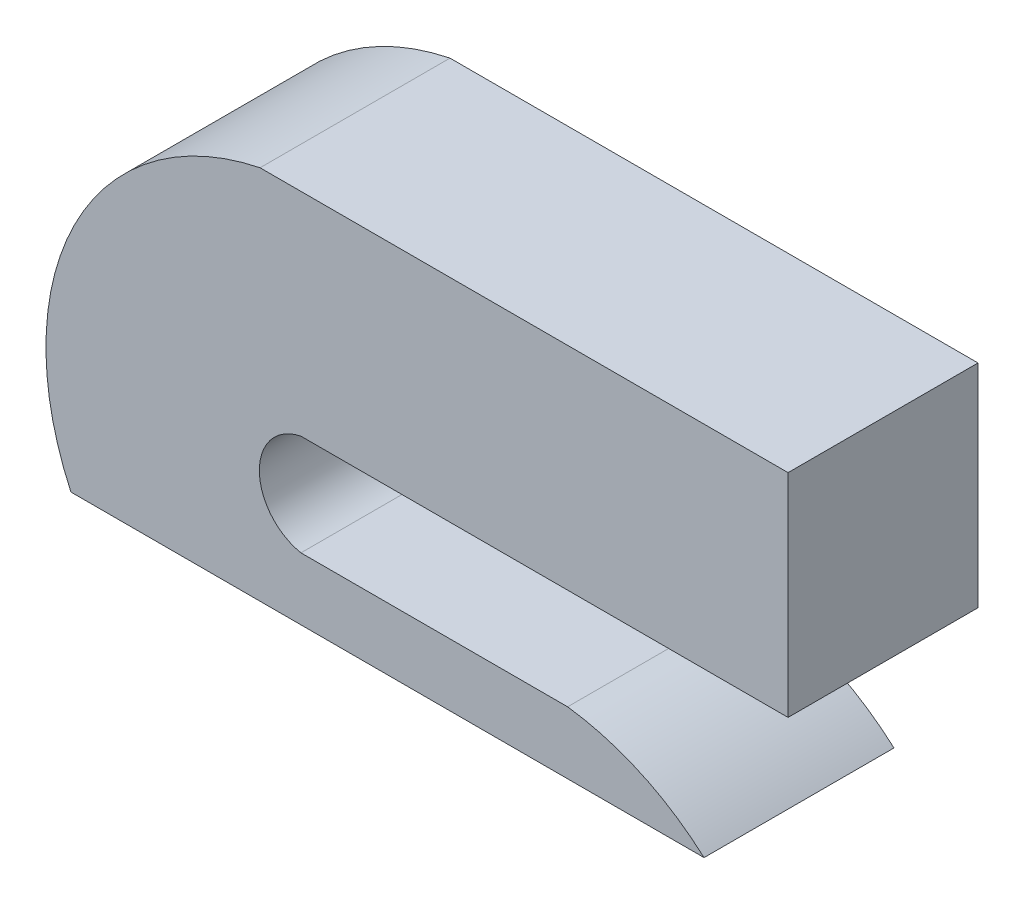
ISO-10303-21;
HEADER;
FILE_DESCRIPTION(('STEP AP214'),'2;1');
FILE_NAME('part.step','',(''),(''),'','','');
FILE_SCHEMA(('AUTOMOTIVE_DESIGN { 1 0 10303 214 1 1 1 1 }'));
ENDSEC;
DATA;
#1=APPLICATION_CONTEXT('core data for automotive mechanical design processes');
#2=APPLICATION_PROTOCOL_DEFINITION('international standard','automotive_design',2000,#1);
#3=PRODUCT_CONTEXT('',#1,'mechanical');
#4=PRODUCT('Part','Part','',(#3));
#5=PRODUCT_RELATED_PRODUCT_CATEGORY('part','',(#4));
#6=PRODUCT_DEFINITION_FORMATION('','',#4);
#7=PRODUCT_DEFINITION_CONTEXT('part definition',#1,'design');
#8=PRODUCT_DEFINITION('design','',#6,#7);
#9=PRODUCT_DEFINITION_SHAPE('','',#8);
#10=(LENGTH_UNIT() NAMED_UNIT(*) SI_UNIT(.MILLI.,.METRE.));
#11=(NAMED_UNIT(*) PLANE_ANGLE_UNIT() SI_UNIT($,.RADIAN.));
#12=(NAMED_UNIT(*) SI_UNIT($,.STERADIAN.) SOLID_ANGLE_UNIT());
#13=UNCERTAINTY_MEASURE_WITH_UNIT(LENGTH_MEASURE(1.E-05),#10,'distance_accuracy_value','');
#14=(GEOMETRIC_REPRESENTATION_CONTEXT(3) GLOBAL_UNCERTAINTY_ASSIGNED_CONTEXT((#13)) GLOBAL_UNIT_ASSIGNED_CONTEXT((#10,
#11,#12)) REPRESENTATION_CONTEXT('',''));
#15=CARTESIAN_POINT('',(0.,0.,0.));
#16=DIRECTION('',(0.,0.,1.));
#17=DIRECTION('',(1.,0.,0.));
#18=AXIS2_PLACEMENT_3D('',#15,#16,#17);
#19=CARTESIAN_POINT('',(-26.474240487687,6.005899301844,0.));
#20=DIRECTION('',(0.,0.,1.));
#21=DIRECTION('',(-0.665645824533168,-0.746267804666367,0.));
#22=AXIS2_PLACEMENT_3D('',#19,#20,#21);
#23=CYLINDRICAL_SURFACE('',#22,0.133821831316658);
#24=CARTESIAN_POINT('',(-26.474240487687,6.005899301844,0.));
#25=DIRECTION('',(0.,0.,-1.));
#26=DIRECTION('',(-0.665645824533168,-0.746267804666367,0.));
#27=AXIS2_PLACEMENT_3D('',#24,#25,#26);
#28=CIRCLE('',#27,0.133821831316658);
#29=CARTESIAN_POINT('',(-26.456998789503,6.138605768833,0.));
#30=VERTEX_POINT('',#29);
#31=CARTESIAN_POINT('',(-26.385162544439,6.105766226117,0.));
#32=VERTEX_POINT('',#31);
#33=EDGE_CURVE('E11',#30,#32,#28,.T.);
#34=ORIENTED_EDGE('',*,*,#33,.F.);
#35=DIRECTION('',(0.,0.,1.));
#36=VECTOR('',#35,1.);
#37=CARTESIAN_POINT('',(-26.456998789503,6.138605768833,0.));
#38=LINE('',#37,#36);
#39=CARTESIAN_POINT('',(-26.456998789503,6.138605768833,0.1));
#40=VERTEX_POINT('',#39);
#41=EDGE_CURVE('E24',#30,#40,#38,.T.);
#42=ORIENTED_EDGE('',*,*,#41,.T.);
#43=CARTESIAN_POINT('',(-26.474240487687,6.005899301844,0.1));
#44=DIRECTION('',(0.,0.,1.));
#45=DIRECTION('',(-0.665645824533168,-0.746267804666367,0.));
#46=AXIS2_PLACEMENT_3D('',#43,#44,#45);
#47=CIRCLE('',#46,0.133821831316658);
#48=CARTESIAN_POINT('',(-26.385162544439,6.105766226117,0.1));
#49=VERTEX_POINT('',#48);
#50=EDGE_CURVE('E100',#49,#40,#47,.T.);
#51=ORIENTED_EDGE('',*,*,#50,.F.);
#52=DIRECTION('',(0.,0.,1.));
#53=VECTOR('',#52,1.);
#54=CARTESIAN_POINT('',(-26.385162544439,6.105766226117,0.));
#55=LINE('',#54,#53);
#56=EDGE_CURVE('E141',#32,#49,#55,.T.);
#57=ORIENTED_EDGE('',*,*,#56,.F.);
#58=EDGE_LOOP('',(#34,#42,#51,#57));
#59=FACE_BOUND('',#58,.T.);
#60=ADVANCED_FACE('F17',(#59),#23,.T.);
#61=CARTESIAN_POINT('',(-26.718499959872,6.105766226117,0.));
#62=DIRECTION('',(0.,-1.,0.));
#63=DIRECTION('',(1.,0.,0.));
#64=AXIS2_PLACEMENT_3D('',#61,#62,#63);
#65=PLANE('',#64);
#66=DIRECTION('',(-1.,0.,0.));
#67=VECTOR('',#66,1.);
#68=CARTESIAN_POINT('',(-26.385162544439,6.105766226117,0.));
#69=LINE('',#68,#67);
#70=CARTESIAN_POINT('',(-26.718499959872,6.105766226117,0.));
#71=VERTEX_POINT('',#70);
#72=EDGE_CURVE('E139',#32,#71,#69,.T.);
#73=ORIENTED_EDGE('',*,*,#72,.F.);
#74=ORIENTED_EDGE('',*,*,#56,.T.);
#75=DIRECTION('',(1.,0.,0.));
#76=VECTOR('',#75,1.);
#77=CARTESIAN_POINT('',(-26.385162544439,6.105766226117,0.1));
#78=LINE('',#77,#76);
#79=CARTESIAN_POINT('',(-26.718499959872,6.105766226117,0.1));
#80=VERTEX_POINT('',#79);
#81=EDGE_CURVE('E137',#80,#49,#78,.T.);
#82=ORIENTED_EDGE('',*,*,#81,.F.);
#83=DIRECTION('',(0.,0.,1.));
#84=VECTOR('',#83,1.);
#85=CARTESIAN_POINT('',(-26.718499959872,6.105766226117,0.));
#86=LINE('',#85,#84);
#87=EDGE_CURVE('E134',#71,#80,#86,.T.);
#88=ORIENTED_EDGE('',*,*,#87,.F.);
#89=EDGE_LOOP('',(#73,#74,#82,#88));
#90=FACE_BOUND('',#89,.T.);
#91=ADVANCED_FACE('F163',(#90),#65,.T.);
#92=CARTESIAN_POINT('',(-26.590617401597,6.165251438178,0.));
#93=DIRECTION('',(0.,0.,1.));
#94=DIRECTION('',(0.200727003701108,-0.97964721710684,0.));
#95=AXIS2_PLACEMENT_3D('',#92,#93,#94);
#96=CYLINDRICAL_SURFACE('',#95,0.141040558580501);
#97=CARTESIAN_POINT('',(-26.590617401597,6.165251438178,0.));
#98=DIRECTION('',(0.,0.,-1.));
#99=DIRECTION('',(0.200727003701108,-0.97964721710684,0.));
#100=AXIS2_PLACEMENT_3D('',#97,#98,#99);
#101=CIRCLE('',#100,0.141040558580501);
#102=CARTESIAN_POINT('',(-26.618928050322,6.30342142889,0.));
#103=VERTEX_POINT('',#102);
#104=EDGE_CURVE('E132',#71,#103,#101,.T.);
#105=ORIENTED_EDGE('',*,*,#104,.F.);
#106=ORIENTED_EDGE('',*,*,#87,.T.);
#107=CARTESIAN_POINT('',(-26.590617401597,6.165251438178,0.1));
#108=DIRECTION('',(0.,0.,1.));
#109=DIRECTION('',(0.200727003701108,-0.97964721710684,0.));
#110=AXIS2_PLACEMENT_3D('',#107,#108,#109);
#111=CIRCLE('',#110,0.141040558580501);
#112=CARTESIAN_POINT('',(-26.618928050322,6.30342142889,0.1));
#113=VERTEX_POINT('',#112);
#114=EDGE_CURVE('E129',#113,#80,#111,.T.);
#115=ORIENTED_EDGE('',*,*,#114,.F.);
#116=DIRECTION('',(0.,0.,1.));
#117=VECTOR('',#116,1.);
#118=CARTESIAN_POINT('',(-26.618928050322,6.30342142889,0.));
#119=LINE('',#118,#117);
#120=EDGE_CURVE('E126',#103,#113,#119,.T.);
#121=ORIENTED_EDGE('',*,*,#120,.F.);
#122=EDGE_LOOP('',(#105,#106,#115,#121));
#123=FACE_BOUND('',#122,.T.);
#124=ADVANCED_FACE('F159',(#123),#96,.T.);
#125=CARTESIAN_POINT('',(-26.340933885794,6.30342142889,0.));
#126=DIRECTION('',(0.,1.,0.));
#127=DIRECTION('',(-1.,0.,0.));
#128=AXIS2_PLACEMENT_3D('',#125,#126,#127);
#129=PLANE('',#128);
#130=DIRECTION('',(1.,0.,0.));
#131=VECTOR('',#130,1.);
#132=CARTESIAN_POINT('',(-26.618928050322,6.30342142889,0.));
#133=LINE('',#132,#131);
#134=CARTESIAN_POINT('',(-26.340933885794,6.30342142889,0.));
#135=VERTEX_POINT('',#134);
#136=EDGE_CURVE('E124',#103,#135,#133,.T.);
#137=ORIENTED_EDGE('',*,*,#136,.F.);
#138=ORIENTED_EDGE('',*,*,#120,.T.);
#139=DIRECTION('',(-1.,0.,0.));
#140=VECTOR('',#139,1.);
#141=CARTESIAN_POINT('',(-26.618928050322,6.30342142889,0.1));
#142=LINE('',#141,#140);
#143=CARTESIAN_POINT('',(-26.340933885794,6.30342142889,0.1));
#144=VERTEX_POINT('',#143);
#145=EDGE_CURVE('E121',#144,#113,#142,.T.);
#146=ORIENTED_EDGE('',*,*,#145,.F.);
#147=DIRECTION('',(0.,0.,1.));
#148=VECTOR('',#147,1.);
#149=CARTESIAN_POINT('',(-26.340933885794,6.30342142889,0.));
#150=LINE('',#149,#148);
#151=EDGE_CURVE('E118',#135,#144,#150,.T.);
#152=ORIENTED_EDGE('',*,*,#151,.F.);
#153=EDGE_LOOP('',(#137,#138,#146,#152));
#154=FACE_BOUND('',#153,.T.);
#155=ADVANCED_FACE('F155',(#154),#129,.T.);
#156=CARTESIAN_POINT('',(-26.340933885794,6.191796411763,0.));
#157=DIRECTION('',(1.,0.,0.));
#158=DIRECTION('',(0.,1.,0.));
#159=AXIS2_PLACEMENT_3D('',#156,#157,#158);
#160=PLANE('',#159);
#161=DIRECTION('',(0.,-1.,0.));
#162=VECTOR('',#161,1.);
#163=CARTESIAN_POINT('',(-26.340933885794,6.30342142889,0.));
#164=LINE('',#163,#162);
#165=CARTESIAN_POINT('',(-26.340933885794,6.191796411763,0.));
#166=VERTEX_POINT('',#165);
#167=EDGE_CURVE('E116',#135,#166,#164,.T.);
#168=ORIENTED_EDGE('',*,*,#167,.F.);
#169=ORIENTED_EDGE('',*,*,#151,.T.);
#170=DIRECTION('',(0.,1.,0.));
#171=VECTOR('',#170,1.);
#172=CARTESIAN_POINT('',(-26.340933885794,6.30342142889,0.1));
#173=LINE('',#172,#171);
#174=CARTESIAN_POINT('',(-26.340933885794,6.191796411763,0.1));
#175=VERTEX_POINT('',#174);
#176=EDGE_CURVE('E113',#175,#144,#173,.T.);
#177=ORIENTED_EDGE('',*,*,#176,.F.);
#178=DIRECTION('',(0.,0.,1.));
#179=VECTOR('',#178,1.);
#180=CARTESIAN_POINT('',(-26.340933885794,6.191796411763,0.));
#181=LINE('',#180,#179);
#182=EDGE_CURVE('E110',#166,#175,#181,.T.);
#183=ORIENTED_EDGE('',*,*,#182,.F.);
#184=EDGE_LOOP('',(#168,#169,#177,#183));
#185=FACE_BOUND('',#184,.T.);
#186=ADVANCED_FACE('F151',(#185),#160,.T.);
#187=CARTESIAN_POINT('',(-26.597399882698,6.191796411763,0.));
#188=DIRECTION('',(0.,-1.,0.));
#189=DIRECTION('',(1.,0.,0.));
#190=AXIS2_PLACEMENT_3D('',#187,#188,#189);
#191=PLANE('',#190);
#192=DIRECTION('',(-1.,0.,0.));
#193=VECTOR('',#192,1.);
#194=CARTESIAN_POINT('',(-26.340933885794,6.191796411763,0.));
#195=LINE('',#194,#193);
#196=CARTESIAN_POINT('',(-26.597399882698,6.191796411763,0.));
#197=VERTEX_POINT('',#196);
#198=EDGE_CURVE('E108',#166,#197,#195,.T.);
#199=ORIENTED_EDGE('',*,*,#198,.F.);
#200=ORIENTED_EDGE('',*,*,#182,.T.);
#201=DIRECTION('',(1.,0.,0.));
#202=VECTOR('',#201,1.);
#203=CARTESIAN_POINT('',(-26.340933885794,6.191796411763,0.1));
#204=LINE('',#203,#202);
#205=CARTESIAN_POINT('',(-26.597399882698,6.191796411763,0.1));
#206=VERTEX_POINT('',#205);
#207=EDGE_CURVE('E106',#206,#175,#204,.T.);
#208=ORIENTED_EDGE('',*,*,#207,.F.);
#209=DIRECTION('',(0.,0.,1.));
#210=VECTOR('',#209,1.);
#211=CARTESIAN_POINT('',(-26.597399882698,6.191796411763,0.));
#212=LINE('',#211,#210);
#213=EDGE_CURVE('E92',#197,#206,#212,.T.);
#214=ORIENTED_EDGE('',*,*,#213,.F.);
#215=EDGE_LOOP('',(#199,#200,#208,#214));
#216=FACE_BOUND('',#215,.T.);
#217=ADVANCED_FACE('F149',(#216),#191,.T.);
#218=CARTESIAN_POINT('',(-26.592216860489,6.165201090298,0.));
#219=DIRECTION('',(0.,0.,1.));
#220=DIRECTION('',(-0.191286059275019,0.981534331303309,0.));
#221=AXIS2_PLACEMENT_3D('',#218,#219,#220);
#222=CYLINDRICAL_SURFACE('',#221,0.0270956609634479);
#223=CARTESIAN_POINT('',(-26.592216860489,6.165201090298,0.));
#224=DIRECTION('',(0.,0.,1.));
#225=DIRECTION('',(-0.191286059275019,0.981534331303309,0.));
#226=AXIS2_PLACEMENT_3D('',#223,#224,#225);
#227=CIRCLE('',#226,0.0270956609634479);
#228=CARTESIAN_POINT('',(-26.597399882698,6.138605768833,0.));
#229=VERTEX_POINT('',#228);
#230=EDGE_CURVE('E95',#197,#229,#227,.T.);
#231=ORIENTED_EDGE('',*,*,#230,.F.);
#232=ORIENTED_EDGE('',*,*,#213,.T.);
#233=CARTESIAN_POINT('',(-26.592216860489,6.165201090298,0.1));
#234=DIRECTION('',(0.,0.,-1.));
#235=DIRECTION('',(-0.191286059275019,0.981534331303309,0.));
#236=AXIS2_PLACEMENT_3D('',#233,#234,#235);
#237=CIRCLE('',#236,0.0270956609634479);
#238=CARTESIAN_POINT('',(-26.597399882698,6.138605768833,0.1));
#239=VERTEX_POINT('',#238);
#240=EDGE_CURVE('E86',#239,#206,#237,.T.);
#241=ORIENTED_EDGE('',*,*,#240,.F.);
#242=DIRECTION('',(0.,0.,1.));
#243=VECTOR('',#242,1.);
#244=CARTESIAN_POINT('',(-26.597399882698,6.138605768833,0.));
#245=LINE('',#244,#243);
#246=EDGE_CURVE('E77',#229,#239,#245,.T.);
#247=ORIENTED_EDGE('',*,*,#246,.F.);
#248=EDGE_LOOP('',(#231,#232,#241,#247));
#249=FACE_BOUND('',#248,.T.);
#250=ADVANCED_FACE('F90',(#249),#222,.F.);
#251=CARTESIAN_POINT('',(-26.456998789503,6.138605768833,0.));
#252=DIRECTION('',(0.,1.,0.));
#253=DIRECTION('',(-1.,0.,0.));
#254=AXIS2_PLACEMENT_3D('',#251,#252,#253);
#255=PLANE('',#254);
#256=DIRECTION('',(1.,0.,0.));
#257=VECTOR('',#256,1.);
#258=CARTESIAN_POINT('',(-26.597399882698,6.138605768833,0.));
#259=LINE('',#258,#257);
#260=EDGE_CURVE('E82',#229,#30,#259,.T.);
#261=ORIENTED_EDGE('',*,*,#260,.F.);
#262=ORIENTED_EDGE('',*,*,#246,.T.);
#263=DIRECTION('',(-1.,0.,0.));
#264=VECTOR('',#263,1.);
#265=CARTESIAN_POINT('',(-26.597399882698,6.138605768833,0.1));
#266=LINE('',#265,#264);
#267=EDGE_CURVE('E81',#40,#239,#266,.T.);
#268=ORIENTED_EDGE('',*,*,#267,.F.);
#269=ORIENTED_EDGE('',*,*,#41,.F.);
#270=EDGE_LOOP('',(#261,#262,#268,#269));
#271=FACE_BOUND('',#270,.T.);
#272=ADVANCED_FACE('F79',(#271),#255,.T.);
#273=CARTESIAN_POINT('',(-26.52064503398,6.192584290167,0.));
#274=DIRECTION('',(0.,0.,1.));
#275=DIRECTION('',(1.,0.,0.));
#276=AXIS2_PLACEMENT_3D('',#273,#274,#275);
#277=PLANE('',#276);
#278=ORIENTED_EDGE('',*,*,#260,.T.);
#279=ORIENTED_EDGE('',*,*,#33,.T.);
#280=ORIENTED_EDGE('',*,*,#72,.T.);
#281=ORIENTED_EDGE('',*,*,#104,.T.);
#282=ORIENTED_EDGE('',*,*,#136,.T.);
#283=ORIENTED_EDGE('',*,*,#167,.T.);
#284=ORIENTED_EDGE('',*,*,#198,.T.);
#285=ORIENTED_EDGE('',*,*,#230,.T.);
#286=EDGE_LOOP('',(#278,#279,#280,#281,#282,#283,#284,#285));
#287=FACE_BOUND('',#286,.T.);
#288=ADVANCED_FACE('F144',(#287),#277,.F.);
#289=CARTESIAN_POINT('',(-26.52064503398,6.192584290167,0.1));
#290=DIRECTION('',(0.,0.,1.));
#291=DIRECTION('',(1.,0.,0.));
#292=AXIS2_PLACEMENT_3D('',#289,#290,#291);
#293=PLANE('',#292);
#294=ORIENTED_EDGE('',*,*,#267,.T.);
#295=ORIENTED_EDGE('',*,*,#240,.T.);
#296=ORIENTED_EDGE('',*,*,#207,.T.);
#297=ORIENTED_EDGE('',*,*,#176,.T.);
#298=ORIENTED_EDGE('',*,*,#145,.T.);
#299=ORIENTED_EDGE('',*,*,#114,.T.);
#300=ORIENTED_EDGE('',*,*,#81,.T.);
#301=ORIENTED_EDGE('',*,*,#50,.T.);
#302=EDGE_LOOP('',(#294,#295,#296,#297,#298,#299,#300,#301));
#303=FACE_BOUND('',#302,.T.);
#304=ADVANCED_FACE('F98',(#303),#293,.T.);
#305=CLOSED_SHELL('',(#60,#91,#124,#155,#186,#217,#250,#272,#288,#304));
#306=MANIFOLD_SOLID_BREP('B1',#305);
#307=ADVANCED_BREP_SHAPE_REPRESENTATION('',(#18,#306),#14);
#308=SHAPE_DEFINITION_REPRESENTATION(#9,#307);
ENDSEC;
END-ISO-10303-21;
